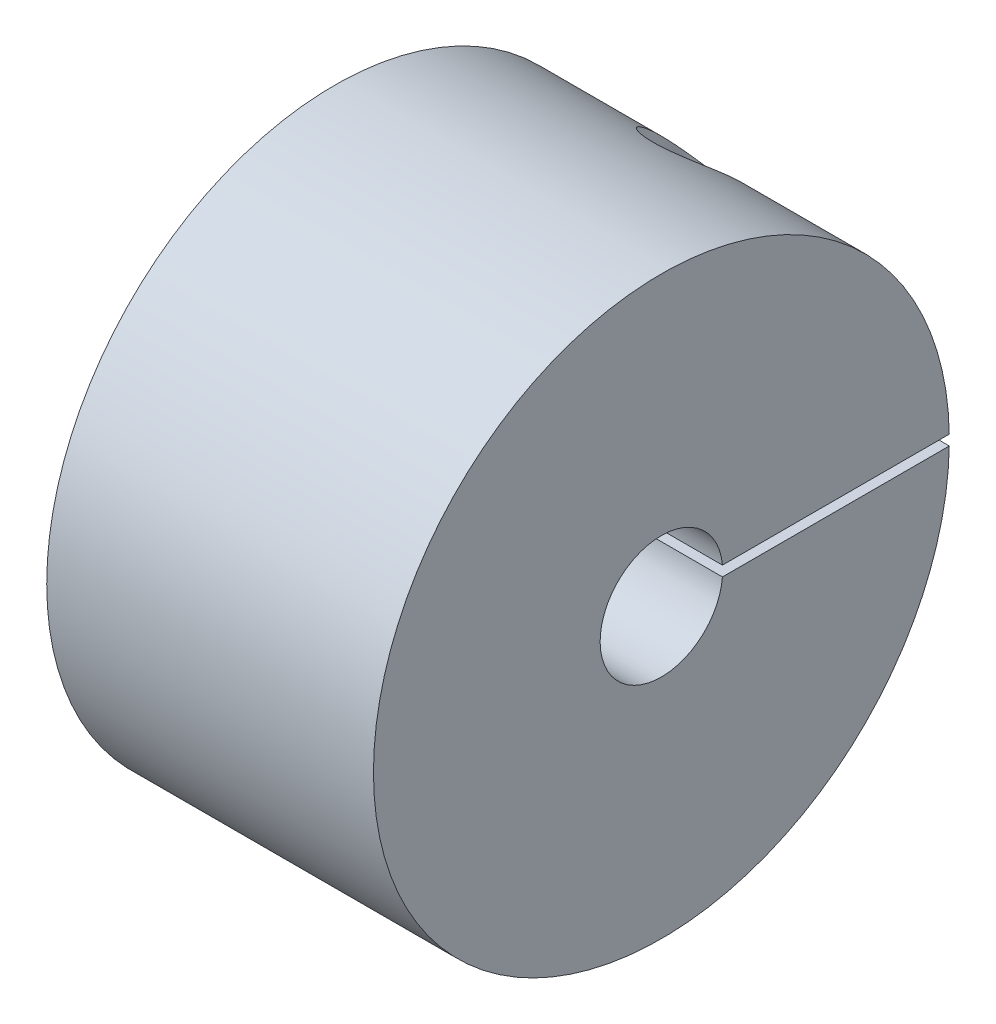
ISO-10303-21;
HEADER;
FILE_DESCRIPTION(('STEP AP214'),'2;1');
FILE_NAME('part.step','',(''),(''),'','','');
FILE_SCHEMA(('AUTOMOTIVE_DESIGN { 1 0 10303 214 1 1 1 1 }'));
ENDSEC;
DATA;
#1=APPLICATION_CONTEXT('core data for automotive mechanical design processes');
#2=APPLICATION_PROTOCOL_DEFINITION('international standard','automotive_design',2000,#1);
#3=PRODUCT_CONTEXT('',#1,'mechanical');
#4=PRODUCT('Part','Part','',(#3));
#5=PRODUCT_RELATED_PRODUCT_CATEGORY('part','',(#4));
#6=PRODUCT_DEFINITION_FORMATION('','',#4);
#7=PRODUCT_DEFINITION_CONTEXT('part definition',#1,'design');
#8=PRODUCT_DEFINITION('design','',#6,#7);
#9=PRODUCT_DEFINITION_SHAPE('','',#8);
#10=(LENGTH_UNIT() NAMED_UNIT(*) SI_UNIT(.MILLI.,.METRE.));
#11=(NAMED_UNIT(*) PLANE_ANGLE_UNIT() SI_UNIT($,.RADIAN.));
#12=(NAMED_UNIT(*) SI_UNIT($,.STERADIAN.) SOLID_ANGLE_UNIT());
#13=UNCERTAINTY_MEASURE_WITH_UNIT(LENGTH_MEASURE(1.E-05),#10,'distance_accuracy_value','');
#14=(GEOMETRIC_REPRESENTATION_CONTEXT(3) GLOBAL_UNCERTAINTY_ASSIGNED_CONTEXT((#13)) GLOBAL_UNIT_ASSIGNED_CONTEXT((#10,
#11,#12)) REPRESENTATION_CONTEXT('',''));
#15=CARTESIAN_POINT('',(0.,0.,0.));
#16=DIRECTION('',(0.,0.,1.));
#17=DIRECTION('',(1.,0.,0.));
#18=AXIS2_PLACEMENT_3D('',#15,#16,#17);
#19=CARTESIAN_POINT('',(8.,-14.1000000006593,-9.60000000065931));
#20=DIRECTION('',(0.,1.,0.));
#21=DIRECTION('',(0.,0.,1.));
#22=AXIS2_PLACEMENT_3D('',#19,#20,#21);
#23=CYLINDRICAL_SURFACE('',#22,2.);
#24=CARTESIAN_POINT('',(8.,-0.249999999999999,-9.60000000065931));
#25=DIRECTION('',(0.,-1.,0.));
#26=DIRECTION('',(1.,0.,0.));
#27=AXIS2_PLACEMENT_3D('',#24,#25,#26);
#28=CIRCLE('',#27,2.);
#29=CARTESIAN_POINT('',(10.,-0.249999999999999,-9.60000000065931));
#30=VERTEX_POINT('',#29);
#31=EDGE_CURVE('E121',#30,#30,#28,.T.);
#32=ORIENTED_EDGE('',*,*,#31,.F.);
#33=EDGE_LOOP('',(#32));
#34=FACE_BOUND('',#33,.T.);
#35=CARTESIAN_POINT('',(8.,-11.8764472805874,-7.60000000065931));
#36=CARTESIAN_POINT('',(8.09849557335779,-11.8764442943103,-7.60000639564407));
#37=CARTESIAN_POINT('',(8.19705056202395,-11.8717738831267,-7.60731838916678));
#38=CARTESIAN_POINT('',(8.39120523369119,-11.8532329684655,-7.63617366288197));
#39=CARTESIAN_POINT('',(8.48680219854359,-11.8393542516558,-7.65772964790816));
#40=CARTESIAN_POINT('',(8.67202489659359,-11.8028921270286,-7.71380854169046));
#41=CARTESIAN_POINT('',(8.76166698681101,-11.7803338273444,-7.74829404090325));
#42=CARTESIAN_POINT('',(8.93314861398951,-11.7271840273751,-7.82850294653475));
#43=CARTESIAN_POINT('',(9.01498794700709,-11.6965923171962,-7.87422664657868));
#44=CARTESIAN_POINT('',(9.17296926899528,-11.6266126712839,-7.97721226985576));
#45=CARTESIAN_POINT('',(9.24867513591191,-11.5868844470704,-8.03490868308102));
#46=CARTESIAN_POINT('',(9.38902685070621,-11.5005435548893,-8.15801163221992));
#47=CARTESIAN_POINT('',(9.45366933814228,-11.4539288031586,-8.22342050059686));
#48=CARTESIAN_POINT('',(9.57991492626822,-11.3478112535087,-8.36937264495241));
#49=CARTESIAN_POINT('',(9.63980160594011,-11.2874180224886,-8.45074905589481));
#50=CARTESIAN_POINT('',(9.7450447887434,-11.160354370561,-8.61786291900973));
#51=CARTESIAN_POINT('',(9.79038826786564,-11.0936783919441,-8.70360420093037));
#52=CARTESIAN_POINT('',(9.8857242430534,-10.9219456199035,-8.91896811968247));
#53=CARTESIAN_POINT('',(9.92745751848532,-10.8138569731998,-9.04985585823879));
#54=CARTESIAN_POINT('',(9.98349882384636,-10.5899887422946,-9.31084644459617));
#55=CARTESIAN_POINT('',(9.99776963484838,-10.4741989404046,-9.44094798933932));
#56=CARTESIAN_POINT('',(10.0017772966432,-10.2359274984884,-9.69881873709935));
#57=CARTESIAN_POINT('',(9.99113720554892,-10.113370802144,-9.82652224628531));
#58=CARTESIAN_POINT('',(9.94680623818913,-9.86552151101052,-10.0753334971887));
#59=CARTESIAN_POINT('',(9.91309024977218,-9.740226079762,-10.1964338979631));
#60=CARTESIAN_POINT('',(9.84123686092182,-9.53834332841877,-10.3846529755358));
#61=CARTESIAN_POINT('',(9.80991255722426,-9.46175443538303,-10.4544570139213));
#62=CARTESIAN_POINT('',(9.73914851009208,-9.3091371768215,-10.5905810745641));
#63=CARTESIAN_POINT('',(9.69970559645986,-9.23310904231277,-10.6568997230904));
#64=CARTESIAN_POINT('',(9.61264734333431,-9.08256354638427,-10.785491414995));
#65=CARTESIAN_POINT('',(9.56504554797757,-9.00804390642396,-10.8477709310583));
#66=CARTESIAN_POINT('',(9.46127491683327,-8.86146702015861,-10.9678331023413));
#67=CARTESIAN_POINT('',(9.40511304939099,-8.78940782880004,-11.0256193580434));
#68=CARTESIAN_POINT('',(9.28153039455346,-8.64682165015593,-11.1378169688399));
#69=CARTESIAN_POINT('',(9.21379926858129,-8.57642366017792,-11.1920540662955));
#70=CARTESIAN_POINT('',(9.06747068780424,-8.44219592155514,-11.2936433370319));
#71=CARTESIAN_POINT('',(8.98888587455862,-8.37835868015887,-11.341003390411));
#72=CARTESIAN_POINT('',(8.8379893911037,-8.27369137880609,-11.4174997002523));
#73=CARTESIAN_POINT('',(8.76796185008818,-8.23086569523558,-11.4483648334211));
#74=CARTESIAN_POINT('',(8.62044523900022,-8.15441350817672,-11.5029450530242));
#75=CARTESIAN_POINT('',(8.54296972309266,-8.12077070627873,-11.5266728150969));
#76=CARTESIAN_POINT('',(8.39977677144873,-8.07224568465267,-11.5606889099398));
#77=CARTESIAN_POINT('',(8.33535937667362,-8.05484187832868,-11.5728026611174));
#78=CARTESIAN_POINT('',(8.20388827884921,-8.02909329397174,-11.5906821699397));
#79=CARTESIAN_POINT('',(8.13683743639083,-8.02073895334274,-11.5964546285378));
#80=CARTESIAN_POINT('',(8.00175666290454,-8.0139558005185,-11.6011436145799));
#81=CARTESIAN_POINT('',(7.93372423554054,-8.01555975043759,-11.6000375119952));
#82=CARTESIAN_POINT('',(7.79906063002303,-8.02858329163364,-11.5910270196744));
#83=CARTESIAN_POINT('',(7.73243045188154,-8.04000965992665,-11.5831179361928));
#84=CARTESIAN_POINT('',(7.59073938482856,-8.07433604612672,-11.5592214332605));
#85=CARTESIAN_POINT('',(7.51629407119135,-8.09891882112479,-11.5420448987001));
#86=CARTESIAN_POINT('',(7.37328053113952,-8.15747393625636,-11.5007347640405));
#87=CARTESIAN_POINT('',(7.30472299140134,-8.19146289615968,-11.4765888464761));
#88=CARTESIAN_POINT('',(7.14225430502542,-8.2844194203942,-11.4097775862553));
#89=CARTESIAN_POINT('',(7.05210184108178,-8.3475203319358,-11.3638016038381));
#90=CARTESIAN_POINT('',(6.88466241132281,-8.48302513255543,-11.2630130114728));
#91=CARTESIAN_POINT('',(6.80740840938558,-8.55545204439857,-11.2081784443644));
#92=CARTESIAN_POINT('',(6.67947077364806,-8.69026120919136,-11.1038307666325));
#93=CARTESIAN_POINT('',(6.62660458009476,-8.75159294537284,-11.0555886652194));
#94=CARTESIAN_POINT('',(6.52763526634768,-8.87669232540847,-10.9553985568442));
#95=CARTESIAN_POINT('',(6.48153594988728,-8.9404613140795,-10.9034484897929));
#96=CARTESIAN_POINT('',(6.39574032194981,-9.069596510807,-10.7962707991757));
#97=CARTESIAN_POINT('',(6.35604780834703,-9.13496363998044,-10.7410412579161));
#98=CARTESIAN_POINT('',(6.2828826516958,-9.26664321140762,-10.6276476437849));
#99=CARTESIAN_POINT('',(6.24941249623128,-9.33295602036855,-10.569482409042));
#100=CARTESIAN_POINT('',(6.15565193234189,-9.5381092708715,-10.3859970838144));
#101=CARTESIAN_POINT('',(6.10556489231372,-9.67773058763805,-10.2561605365325));
#102=CARTESIAN_POINT('',(6.03291680546786,-9.95501997462193,-9.98723605145258));
#103=CARTESIAN_POINT('',(6.01033840974987,-10.0926892217423,-9.84815400295772));
#104=CARTESIAN_POINT('',(5.995911327845,-10.3512364685505,-9.57570214879262));
#105=CARTESIAN_POINT('',(6.00157751705353,-10.4725378950032,-9.44287610835386));
#106=CARTESIAN_POINT('',(6.04101029969704,-10.7080038983562,-9.17498224618953));
#107=CARTESIAN_POINT('',(6.07474708792385,-10.8221759070604,-9.0399169511097));
#108=CARTESIAN_POINT('',(6.16268643593124,-11.015939404778,-8.8021151525557));
#109=CARTESIAN_POINT('',(6.21074680937771,-11.0976096394407,-8.69880874124855));
#110=CARTESIAN_POINT('',(6.32729237946403,-11.2524996347212,-8.49748782816569));
#111=CARTESIAN_POINT('',(6.39575081997392,-11.3257302920929,-8.3994665915212));
#112=CARTESIAN_POINT('',(6.53995859407503,-11.4496985402665,-8.22943047849061));
#113=CARTESIAN_POINT('',(6.61239206233602,-11.5021351903324,-8.15585162410045));
#114=CARTESIAN_POINT('',(6.77118255092034,-11.5982786714542,-8.01853799321284));
#115=CARTESIAN_POINT('',(6.85753914599054,-11.6419857690451,-7.95480291617394));
#116=CARTESIAN_POINT('',(7.0435353380282,-11.7195260296589,-7.84012561497045));
#117=CARTESIAN_POINT('',(7.14326743224549,-11.7532846672563,-7.78928032723251));
#118=CARTESIAN_POINT('',(7.30009300647539,-11.7951500312514,-7.72561175519497));
#119=CARTESIAN_POINT('',(7.35356151880368,-11.8076414555221,-7.70649131925887));
#120=CARTESIAN_POINT('',(7.46249060312748,-11.8296007773789,-7.67274077142276));
#121=CARTESIAN_POINT('',(7.51795034985243,-11.8390699118275,-7.65810882271937));
#122=CARTESIAN_POINT('',(7.64360643040175,-11.8567413782221,-7.63072833745359));
#123=CARTESIAN_POINT('',(7.71419819993936,-11.8641206104882,-7.61923423398853));
#124=CARTESIAN_POINT('',(7.85651623630537,-11.8739743219884,-7.60386824503348));
#125=CARTESIAN_POINT('',(7.92824235034387,-11.8764494562001,-7.59999534167758));
#126=CARTESIAN_POINT('',(8.,-11.8764472805874,-7.60000000065931));
#127=B_SPLINE_CURVE_WITH_KNOTS('',3,(#35,#36,#37,#38,#39,#40,#41,#42,#43,#44,#45,#46,#47,#48,
#49,#50,#51,#52,#53,#54,#55,#56,#57,#58,#59,#60,#61,#62,#63,#64,#65,#66,#67,#68,#69,#70,#71,#72,
#73,#74,#75,#76,#77,#78,#79,#80,#81,#82,#83,#84,#85,#86,#87,#88,#89,#90,#91,#92,#93,#94,#95,#96,
#97,#98,#99,#100,#101,#102,#103,#104,#105,#106,#107,#108,#109,#110,#111,#112,#113,#114,#115,
#116,#117,#118,#119,#120,#121,#122,#123,#124,#125,#126),.UNSPECIFIED.,.T.,.F.,(4,2,2,2,2,2,2,2,
2,2,2,2,2,2,2,2,2,2,2,2,2,2,2,2,2,2,2,2,2,2,2,2,2,2,2,2,2,2,2,2,2,2,2,2,2,4),(0.,
0.295216287816718,0.590696247913736,0.885327798661954,1.17996704819163,1.4881791246726,
1.79648465339066,2.14830053296393,2.50043060346508,3.0219775647384,3.54423086412443,
4.07443765283337,4.60522235398175,4.92968371093524,5.25427200644988,5.5783265980832,
5.90211878755962,6.23659416828575,6.57068321190933,6.83293980955808,7.09472786387476,
7.29734925615553,7.49975632833424,7.70282965841101,7.90604321228719,8.14549687812242,
8.38537636558273,8.74118073733178,9.09788094322736,9.38027525271235,9.66282769611722,
9.94554702285892,10.2283791336504,10.817474607292,11.4061983629496,11.9440865686413,
12.4814043753281,12.9004079543008,13.3188643281098,13.6648514823974,14.010828071224,
14.359334124976,14.5335184964871,14.7076314919292,14.9227361517671,15.137812080885),.UNSPECIFIED.);
#128=CARTESIAN_POINT('',(8.,-11.8764472805874,-7.60000000065931));
#129=VERTEX_POINT('',#128);
#130=EDGE_CURVE('E50',#129,#129,#127,.T.);
#131=ORIENTED_EDGE('',*,*,#130,.F.);
#132=EDGE_LOOP('',(#131));
#133=FACE_BOUND('',#132,.T.);
#134=ADVANCED_FACE('F45',(#34,#133),#23,.F.);
#135=CARTESIAN_POINT('',(16.,0.,0.));
#136=DIRECTION('',(-1.,0.,0.));
#137=DIRECTION('',(0.,0.,1.));
#138=AXIS2_PLACEMENT_3D('',#135,#136,#137);
#139=CYLINDRICAL_SURFACE('',#138,14.1000000006593);
#140=ORIENTED_EDGE('',*,*,#130,.T.);
#141=EDGE_LOOP('',(#140));
#142=FACE_BOUND('',#141,.T.);
#143=CARTESIAN_POINT('',(8.,11.8764472805874,-7.60000000065931));
#144=CARTESIAN_POINT('',(7.90150442664221,11.8764442943103,-7.60000639564407));
#145=CARTESIAN_POINT('',(7.80294943797605,11.8717738831267,-7.60731838916678));
#146=CARTESIAN_POINT('',(7.60879476630881,11.8532329684655,-7.63617366288197));
#147=CARTESIAN_POINT('',(7.51319780145641,11.8393542516558,-7.65772964790816));
#148=CARTESIAN_POINT('',(7.32797510340641,11.8028921270286,-7.71380854169046));
#149=CARTESIAN_POINT('',(7.23833301318899,11.7803338273444,-7.74829404090325));
#150=CARTESIAN_POINT('',(7.06685138601049,11.7271840273751,-7.82850294653475));
#151=CARTESIAN_POINT('',(6.98501205299291,11.6965923171962,-7.87422664657868));
#152=CARTESIAN_POINT('',(6.82703073100472,11.6266126712839,-7.97721226985576));
#153=CARTESIAN_POINT('',(6.75132486408809,11.5868844470704,-8.03490868308102));
#154=CARTESIAN_POINT('',(6.61097314929379,11.5005435548893,-8.15801163221992));
#155=CARTESIAN_POINT('',(6.54633066185772,11.4539288031586,-8.22342050059686));
#156=CARTESIAN_POINT('',(6.42008507373178,11.3478112535087,-8.36937264495241));
#157=CARTESIAN_POINT('',(6.36019839405989,11.2874180224886,-8.45074905589481));
#158=CARTESIAN_POINT('',(6.2549552112566,11.160354370561,-8.61786291900973));
#159=CARTESIAN_POINT('',(6.20961173213436,11.0936783919441,-8.70360420093037));
#160=CARTESIAN_POINT('',(6.1142757569466,10.9219456199035,-8.91896811968247));
#161=CARTESIAN_POINT('',(6.07254248151468,10.8138569731998,-9.0498558582388));
#162=CARTESIAN_POINT('',(6.01650117615364,10.5899887422946,-9.31084644459618));
#163=CARTESIAN_POINT('',(6.00223036515162,10.4741989404046,-9.44094798933933));
#164=CARTESIAN_POINT('',(5.99822270335677,10.2359274984884,-9.69881873709936));
#165=CARTESIAN_POINT('',(6.00886279445108,10.113370802144,-9.82652224628531));
#166=CARTESIAN_POINT('',(6.05319376181088,9.86552151101051,-10.0753334971887));
#167=CARTESIAN_POINT('',(6.08690975022782,9.74022607976199,-10.1964338979631));
#168=CARTESIAN_POINT('',(6.15876313907818,9.53834332841876,-10.3846529755358));
#169=CARTESIAN_POINT('',(6.19008744277575,9.46175443538303,-10.4544570139213));
#170=CARTESIAN_POINT('',(6.26085148990792,9.3091371768215,-10.5905810745641));
#171=CARTESIAN_POINT('',(6.30029440354014,9.23310904231277,-10.6568997230904));
#172=CARTESIAN_POINT('',(6.38735265666569,9.08256354638426,-10.785491414995));
#173=CARTESIAN_POINT('',(6.43495445202244,9.00804390642396,-10.8477709310583));
#174=CARTESIAN_POINT('',(6.53872508316674,8.86146702015861,-10.9678331023413));
#175=CARTESIAN_POINT('',(6.59488695060901,8.78940782880004,-11.0256193580434));
#176=CARTESIAN_POINT('',(6.71846960544654,8.64682165015593,-11.1378169688399));
#177=CARTESIAN_POINT('',(6.78620073141871,8.57642366017792,-11.1920540662955));
#178=CARTESIAN_POINT('',(6.93252931219577,8.44219592155514,-11.2936433370319));
#179=CARTESIAN_POINT('',(7.01111412544139,8.37835868015886,-11.341003390411));
#180=CARTESIAN_POINT('',(7.16201060889631,8.27369137880608,-11.4174997002523));
#181=CARTESIAN_POINT('',(7.23203814991183,8.23086569523557,-11.4483648334211));
#182=CARTESIAN_POINT('',(7.37955476099979,8.15441350817671,-11.5029450530242));
#183=CARTESIAN_POINT('',(7.45703027690735,8.12077070627873,-11.5266728150969));
#184=CARTESIAN_POINT('',(7.60022322855128,8.07224568465266,-11.5606889099398));
#185=CARTESIAN_POINT('',(7.66464062332639,8.05484187832868,-11.5728026611174));
#186=CARTESIAN_POINT('',(7.79611172115079,8.02909329397174,-11.5906821699397));
#187=CARTESIAN_POINT('',(7.86316256360918,8.02073895334274,-11.5964546285378));
#188=CARTESIAN_POINT('',(7.99824333709547,8.0139558005185,-11.6011436145799));
#189=CARTESIAN_POINT('',(8.06627576445946,8.0155597504376,-11.6000375119952));
#190=CARTESIAN_POINT('',(8.20093936997698,8.02858329163364,-11.5910270196744));
#191=CARTESIAN_POINT('',(8.26756954811846,8.04000965992665,-11.5831179361928));
#192=CARTESIAN_POINT('',(8.40926061517145,8.07433604612672,-11.5592214332605));
#193=CARTESIAN_POINT('',(8.48370592880865,8.09891882112479,-11.5420448987001));
#194=CARTESIAN_POINT('',(8.62671946886048,8.15747393625636,-11.5007347640405));
#195=CARTESIAN_POINT('',(8.69527700859866,8.19146289615968,-11.4765888464761));
#196=CARTESIAN_POINT('',(8.85774569497458,8.28441942039421,-11.4097775862553));
#197=CARTESIAN_POINT('',(8.94789815891822,8.34752033193581,-11.3638016038381));
#198=CARTESIAN_POINT('',(9.11533758867719,8.48302513255544,-11.2630130114728));
#199=CARTESIAN_POINT('',(9.19259159061442,8.55545204439857,-11.2081784443644));
#200=CARTESIAN_POINT('',(9.32052922635194,8.69026120919136,-11.1038307666325));
#201=CARTESIAN_POINT('',(9.37339541990524,8.75159294537284,-11.0555886652194));
#202=CARTESIAN_POINT('',(9.47236473365232,8.87669232540848,-10.9553985568442));
#203=CARTESIAN_POINT('',(9.51846405011272,8.94046131407951,-10.9034484897929));
#204=CARTESIAN_POINT('',(9.60425967805019,9.06959651080701,-10.7962707991757));
#205=CARTESIAN_POINT('',(9.64395219165297,9.13496363998044,-10.7410412579161));
#206=CARTESIAN_POINT('',(9.71711734830421,9.26664321140763,-10.6276476437849));
#207=CARTESIAN_POINT('',(9.75058750376872,9.33295602036856,-10.569482409042));
#208=CARTESIAN_POINT('',(9.84434806765812,9.5381092708715,-10.3859970838144));
#209=CARTESIAN_POINT('',(9.89443510768628,9.67773058763805,-10.2561605365325));
#210=CARTESIAN_POINT('',(9.96708319453215,9.95501997462194,-9.98723605145257));
#211=CARTESIAN_POINT('',(9.98966159025013,10.0926892217423,-9.84815400295771));
#212=CARTESIAN_POINT('',(10.004088672155,10.3512364685506,-9.57570214879261));
#213=CARTESIAN_POINT('',(9.99842248294647,10.4725378950032,-9.44287610835385));
#214=CARTESIAN_POINT('',(9.95898970030296,10.7080038983562,-9.17498224618952));
#215=CARTESIAN_POINT('',(9.92525291207615,10.8221759070604,-9.03991695110969));
#216=CARTESIAN_POINT('',(9.83731356406876,11.015939404778,-8.80211515255569));
#217=CARTESIAN_POINT('',(9.78925319062229,11.0976096394407,-8.69880874124855));
#218=CARTESIAN_POINT('',(9.67270762053596,11.2524996347212,-8.49748782816569));
#219=CARTESIAN_POINT('',(9.60424918002608,11.3257302920929,-8.3994665915212));
#220=CARTESIAN_POINT('',(9.46004140592497,11.4496985402665,-8.2294304784906));
#221=CARTESIAN_POINT('',(9.38760793766398,11.5021351903324,-8.15585162410045));
#222=CARTESIAN_POINT('',(9.22881744907966,11.5982786714542,-8.01853799321284));
#223=CARTESIAN_POINT('',(9.14246085400945,11.6419857690451,-7.95480291617393));
#224=CARTESIAN_POINT('',(8.95646466197179,11.7195260296589,-7.84012561497045));
#225=CARTESIAN_POINT('',(8.85673256775451,11.7532846672563,-7.7892803272325));
#226=CARTESIAN_POINT('',(8.6999069935246,11.7951500312514,-7.72561175519496));
#227=CARTESIAN_POINT('',(8.64643848119631,11.8076414555221,-7.70649131925886));
#228=CARTESIAN_POINT('',(8.53750939687251,11.8296007773789,-7.67274077142276));
#229=CARTESIAN_POINT('',(8.48204965014756,11.8390699118275,-7.65810882271937));
#230=CARTESIAN_POINT('',(8.35639356959824,11.8567413782221,-7.63072833745359));
#231=CARTESIAN_POINT('',(8.28580180006063,11.8641206104882,-7.61923423398853));
#232=CARTESIAN_POINT('',(8.14348376369463,11.8739743219884,-7.60386824503348));
#233=CARTESIAN_POINT('',(8.07175764965613,11.8764494562001,-7.59999534167758));
#234=CARTESIAN_POINT('',(8.,11.8764472805874,-7.60000000065931));
#235=B_SPLINE_CURVE_WITH_KNOTS('',3,(#143,#144,#145,#146,#147,#148,#149,#150,#151,#152,#153,
#154,#155,#156,#157,#158,#159,#160,#161,#162,#163,#164,#165,#166,#167,#168,#169,#170,#171,#172,
#173,#174,#175,#176,#177,#178,#179,#180,#181,#182,#183,#184,#185,#186,#187,#188,#189,#190,#191,
#192,#193,#194,#195,#196,#197,#198,#199,#200,#201,#202,#203,#204,#205,#206,#207,#208,#209,#210,
#211,#212,#213,#214,#215,#216,#217,#218,#219,#220,#221,#222,#223,#224,#225,#226,#227,#228,#229,
#230,#231,#232,#233,#234),.UNSPECIFIED.,.T.,.F.,(4,2,2,2,2,2,2,2,2,2,2,2,2,2,2,2,2,2,2,2,2,2,2,
2,2,2,2,2,2,2,2,2,2,2,2,2,2,2,2,2,2,2,2,2,2,4),(0.,0.295216287816719,0.590696247913737,
0.885327798661953,1.17996704819163,1.4881791246726,1.79648465339066,2.14830053296393,
2.50043060346508,3.02197756473841,3.54423086412443,4.07443765283338,4.60522235398176,
4.92968371093525,5.25427200644989,5.5783265980832,5.90211878755963,6.23659416828575,
6.57068321190934,6.83293980955809,7.09472786387477,7.29734925615554,7.49975632833425,
7.70282965841101,7.90604321228719,8.14549687812242,8.38537636558273,8.74118073733178,
9.09788094322736,9.38027525271235,9.66282769611722,9.94554702285893,10.2283791336504,
10.817474607292,11.4061983629496,11.9440865686413,12.4814043753281,12.9004079543009,
13.3188643281098,13.6648514823975,14.010828071224,14.359334124976,14.5335184964871,
14.7076314919292,14.9227361517671,15.137812080885),.UNSPECIFIED.);
#236=CARTESIAN_POINT('',(8.,11.8764472805874,-7.60000000065931));
#237=VERTEX_POINT('',#236);
#238=EDGE_CURVE('E167',#237,#237,#235,.T.);
#239=ORIENTED_EDGE('',*,*,#238,.T.);
#240=EDGE_LOOP('',(#239));
#241=FACE_BOUND('',#240,.T.);
#242=CARTESIAN_POINT('',(0.,0.,0.));
#243=DIRECTION('',(1.,0.,0.));
#244=DIRECTION('',(0.,0.,-1.));
#245=AXIS2_PLACEMENT_3D('',#242,#243,#244);
#246=CIRCLE('',#245,14.1000000006593);
#247=CARTESIAN_POINT('',(0.,0.250000000000002,-14.0977835143895));
#248=VERTEX_POINT('',#247);
#249=CARTESIAN_POINT('',(0.,-0.249999999999998,-14.0977835143895));
#250=VERTEX_POINT('',#249);
#251=EDGE_CURVE('E60',#248,#250,#246,.T.);
#252=ORIENTED_EDGE('',*,*,#251,.T.);
#253=DIRECTION('',(-1.,0.,0.));
#254=VECTOR('',#253,1.);
#255=CARTESIAN_POINT('',(16.,-0.250000000000001,-14.0977835143895));
#256=LINE('',#255,#254);
#257=CARTESIAN_POINT('',(16.,-0.250000000000001,-14.0977835143895));
#258=VERTEX_POINT('',#257);
#259=EDGE_CURVE('E96',#258,#250,#256,.T.);
#260=ORIENTED_EDGE('',*,*,#259,.F.);
#261=CARTESIAN_POINT('',(16.,0.,0.));
#262=DIRECTION('',(1.,0.,0.));
#263=DIRECTION('',(0.,0.,-1.));
#264=AXIS2_PLACEMENT_3D('',#261,#262,#263);
#265=CIRCLE('',#264,14.1000000006593);
#266=CARTESIAN_POINT('',(16.,0.249999999999999,-14.0977835143895));
#267=VERTEX_POINT('',#266);
#268=EDGE_CURVE('E11',#267,#258,#265,.T.);
#269=ORIENTED_EDGE('',*,*,#268,.F.);
#270=DIRECTION('',(-1.,0.,0.));
#271=VECTOR('',#270,1.);
#272=CARTESIAN_POINT('',(16.,0.249999999999999,-14.0977835143895));
#273=LINE('',#272,#271);
#274=EDGE_CURVE('E110',#248,#267,#273,.F.);
#275=ORIENTED_EDGE('',*,*,#274,.F.);
#276=EDGE_LOOP('',(#252,#260,#269,#275));
#277=FACE_BOUND('',#276,.T.);
#278=ADVANCED_FACE('F47',(#142,#241,#277),#139,.T.);
#279=CARTESIAN_POINT('',(16.,0.,0.));
#280=DIRECTION('',(1.,0.,0.));
#281=DIRECTION('',(0.,0.,-1.));
#282=AXIS2_PLACEMENT_3D('',#279,#280,#281);
#283=PLANE('',#282);
#284=DIRECTION('',(0.,0.,1.));
#285=VECTOR('',#284,1.);
#286=CARTESIAN_POINT('',(16.,-0.250000000000001,14.1010000006593));
#287=LINE('',#286,#285);
#288=CARTESIAN_POINT('',(16.,-0.250000000000001,-2.98956518577534));
#289=VERTEX_POINT('',#288);
#290=EDGE_CURVE('E92',#258,#289,#287,.T.);
#291=ORIENTED_EDGE('',*,*,#290,.T.);
#292=CARTESIAN_POINT('',(16.,0.,0.));
#293=DIRECTION('',(1.,0.,0.));
#294=DIRECTION('',(0.,-0.707106781188731,-0.707106781184364));
#295=AXIS2_PLACEMENT_3D('',#292,#293,#294);
#296=ELLIPSE('',#295,2.99999999999999,2.99999999999999);
#297=CARTESIAN_POINT('',(16.,0.249999999999999,-2.98956518577534));
#298=VERTEX_POINT('',#297);
#299=EDGE_CURVE('E113',#298,#289,#296,.T.);
#300=ORIENTED_EDGE('',*,*,#299,.F.);
#301=DIRECTION('',(0.,0.,-1.));
#302=VECTOR('',#301,1.);
#303=CARTESIAN_POINT('',(16.,0.249999999999999,14.1010000006593));
#304=LINE('',#303,#302);
#305=EDGE_CURVE('E76',#298,#267,#304,.T.);
#306=ORIENTED_EDGE('',*,*,#305,.T.);
#307=ORIENTED_EDGE('',*,*,#268,.T.);
#308=EDGE_LOOP('',(#291,#300,#306,#307));
#309=FACE_BOUND('',#308,.T.);
#310=ADVANCED_FACE('F112',(#309),#283,.T.);
#311=CARTESIAN_POINT('',(0.,0.,0.));
#312=DIRECTION('',(1.,0.,0.));
#313=DIRECTION('',(0.,0.,-1.));
#314=AXIS2_PLACEMENT_3D('',#311,#312,#313);
#315=PLANE('',#314);
#316=CARTESIAN_POINT('',(0.,0.,0.));
#317=DIRECTION('',(1.,0.,0.));
#318=DIRECTION('',(0.,-0.707106781188731,-0.707106781184364));
#319=AXIS2_PLACEMENT_3D('',#316,#317,#318);
#320=ELLIPSE('',#319,2.99999999999999,2.99999999999999);
#321=CARTESIAN_POINT('',(0.,0.249999999999999,-2.98956518577534));
#322=VERTEX_POINT('',#321);
#323=CARTESIAN_POINT('',(0.,-0.250000000000001,-2.98956518577534));
#324=VERTEX_POINT('',#323);
#325=EDGE_CURVE('E133',#322,#324,#320,.T.);
#326=ORIENTED_EDGE('',*,*,#325,.T.);
#327=DIRECTION('',(0.,0.,1.));
#328=VECTOR('',#327,1.);
#329=CARTESIAN_POINT('',(0.,-0.249999999999998,14.1010000006593));
#330=LINE('',#329,#328);
#331=EDGE_CURVE('E68',#250,#324,#330,.T.);
#332=ORIENTED_EDGE('',*,*,#331,.F.);
#333=ORIENTED_EDGE('',*,*,#251,.F.);
#334=DIRECTION('',(0.,0.,-1.));
#335=VECTOR('',#334,1.);
#336=CARTESIAN_POINT('',(0.,0.250000000000002,14.1010000006593));
#337=LINE('',#336,#335);
#338=EDGE_CURVE('E109',#322,#248,#337,.T.);
#339=ORIENTED_EDGE('',*,*,#338,.F.);
#340=EDGE_LOOP('',(#326,#332,#333,#339));
#341=FACE_BOUND('',#340,.T.);
#342=ADVANCED_FACE('F139',(#341),#315,.F.);
#343=DIRECTION('',(-1.,0.,0.));
#344=VECTOR('',#343,1.);
#345=SURFACE_OF_LINEAR_EXTRUSION('',#296,#344);
#346=DIRECTION('',(-1.,0.,0.));
#347=VECTOR('',#346,1.);
#348=CARTESIAN_POINT('',(16.,-0.250000000000001,-2.98956518577534));
#349=LINE('',#348,#347);
#350=EDGE_CURVE('E97',#289,#324,#349,.T.);
#351=ORIENTED_EDGE('',*,*,#350,.T.);
#352=ORIENTED_EDGE('',*,*,#325,.F.);
#353=DIRECTION('',(-1.,0.,0.));
#354=VECTOR('',#353,1.);
#355=CARTESIAN_POINT('',(16.,0.249999999999999,-2.98956518577534));
#356=LINE('',#355,#354);
#357=EDGE_CURVE('E116',#322,#298,#356,.F.);
#358=ORIENTED_EDGE('',*,*,#357,.T.);
#359=ORIENTED_EDGE('',*,*,#299,.T.);
#360=EDGE_LOOP('',(#351,#352,#358,#359));
#361=FACE_BOUND('',#360,.T.);
#362=ADVANCED_FACE('F135',(#361),#345,.T.);
#363=CARTESIAN_POINT('',(8.,0.25,-9.60000000065931));
#364=DIRECTION('',(0.,1.,0.));
#365=DIRECTION('',(-1.,0.,0.));
#366=AXIS2_PLACEMENT_3D('',#363,#364,#365);
#367=CIRCLE('',#366,2.);
#368=CARTESIAN_POINT('',(6.,0.250000000000001,-9.60000000065931));
#369=VERTEX_POINT('',#368);
#370=EDGE_CURVE('E115',#369,#369,#367,.T.);
#371=ORIENTED_EDGE('',*,*,#370,.F.);
#372=EDGE_LOOP('',(#371));
#373=FACE_BOUND('',#372,.T.);
#374=ORIENTED_EDGE('',*,*,#238,.F.);
#375=EDGE_LOOP('',(#374));
#376=FACE_BOUND('',#375,.T.);
#377=ADVANCED_FACE('F138',(#373,#376),#23,.F.);
#378=CARTESIAN_POINT('',(-1.6335048307452,0.250000000000002,14.1010000006593));
#379=DIRECTION('',(0.,1.,0.));
#380=DIRECTION('',(-1.,0.,0.));
#381=AXIS2_PLACEMENT_3D('',#378,#379,#380);
#382=PLANE('',#381);
#383=ORIENTED_EDGE('',*,*,#274,.T.);
#384=ORIENTED_EDGE('',*,*,#305,.F.);
#385=ORIENTED_EDGE('',*,*,#357,.F.);
#386=ORIENTED_EDGE('',*,*,#338,.T.);
#387=EDGE_LOOP('',(#383,#384,#385,#386));
#388=FACE_BOUND('',#387,.T.);
#389=ORIENTED_EDGE('',*,*,#370,.T.);
#390=EDGE_LOOP('',(#389));
#391=FACE_BOUND('',#390,.T.);
#392=ADVANCED_FACE('F158',(#388,#391),#382,.F.);
#393=CARTESIAN_POINT('',(-1.6335048307452,-0.249999999999998,14.1010000006593));
#394=DIRECTION('',(0.,-1.,0.));
#395=DIRECTION('',(1.,0.,0.));
#396=AXIS2_PLACEMENT_3D('',#393,#394,#395);
#397=PLANE('',#396);
#398=ORIENTED_EDGE('',*,*,#259,.T.);
#399=ORIENTED_EDGE('',*,*,#331,.T.);
#400=ORIENTED_EDGE('',*,*,#350,.F.);
#401=ORIENTED_EDGE('',*,*,#290,.F.);
#402=EDGE_LOOP('',(#398,#399,#400,#401));
#403=FACE_BOUND('',#402,.T.);
#404=ORIENTED_EDGE('',*,*,#31,.T.);
#405=EDGE_LOOP('',(#404));
#406=FACE_BOUND('',#405,.T.);
#407=ADVANCED_FACE('F94',(#403,#406),#397,.F.);
#408=CLOSED_SHELL('',(#134,#278,#310,#342,#362,#377,#392,#407));
#409=MANIFOLD_SOLID_BREP('B2',#408);
#410=ADVANCED_BREP_SHAPE_REPRESENTATION('',(#18,#409),#14);
#411=SHAPE_DEFINITION_REPRESENTATION(#9,#410);
ENDSEC;
END-ISO-10303-21;
